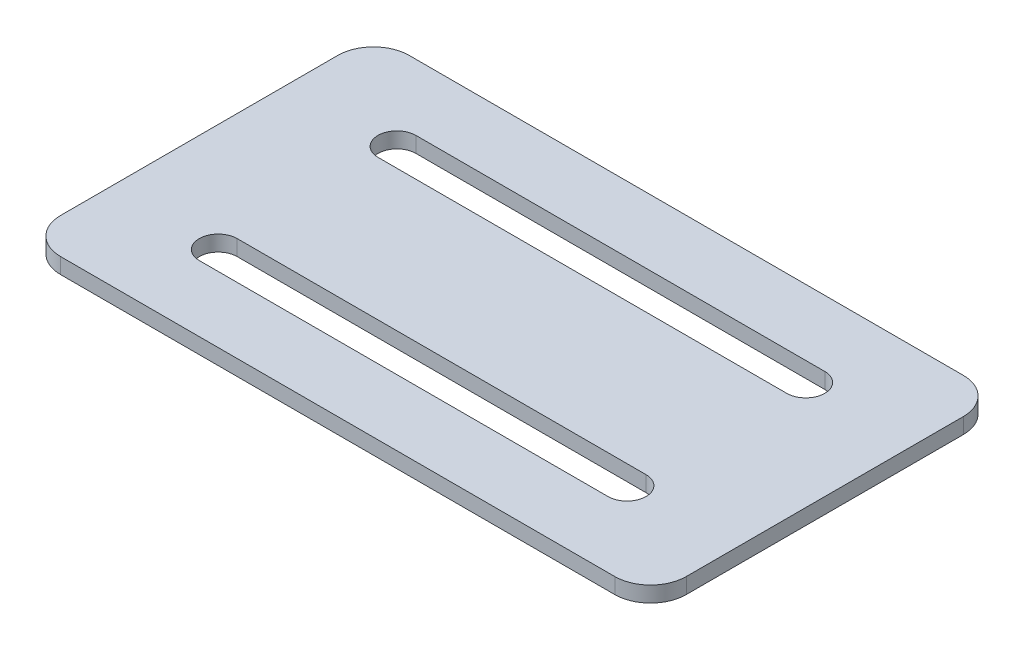
ISO-10303-21;
HEADER;
FILE_DESCRIPTION(('STEP AP214'),'2;1');
FILE_NAME('part.step','',(''),(''),'','','');
FILE_SCHEMA(('AUTOMOTIVE_DESIGN { 1 0 10303 214 1 1 1 1 }'));
ENDSEC;
DATA;
#1=APPLICATION_CONTEXT('core data for automotive mechanical design processes');
#2=APPLICATION_PROTOCOL_DEFINITION('international standard','automotive_design',2000,#1);
#3=PRODUCT_CONTEXT('',#1,'mechanical');
#4=PRODUCT('Part','Part','',(#3));
#5=PRODUCT_RELATED_PRODUCT_CATEGORY('part','',(#4));
#6=PRODUCT_DEFINITION_FORMATION('','',#4);
#7=PRODUCT_DEFINITION_CONTEXT('part definition',#1,'design');
#8=PRODUCT_DEFINITION('design','',#6,#7);
#9=PRODUCT_DEFINITION_SHAPE('','',#8);
#10=(LENGTH_UNIT() NAMED_UNIT(*) SI_UNIT(.MILLI.,.METRE.));
#11=(NAMED_UNIT(*) PLANE_ANGLE_UNIT() SI_UNIT($,.RADIAN.));
#12=(NAMED_UNIT(*) SI_UNIT($,.STERADIAN.) SOLID_ANGLE_UNIT());
#13=UNCERTAINTY_MEASURE_WITH_UNIT(LENGTH_MEASURE(1.E-05),#10,'distance_accuracy_value','');
#14=(GEOMETRIC_REPRESENTATION_CONTEXT(3) GLOBAL_UNCERTAINTY_ASSIGNED_CONTEXT((#13)) GLOBAL_UNIT_ASSIGNED_CONTEXT((#10,
#11,#12)) REPRESENTATION_CONTEXT('',''));
#15=CARTESIAN_POINT('',(0.,0.,0.));
#16=DIRECTION('',(0.,0.,1.));
#17=DIRECTION('',(1.,0.,0.));
#18=AXIS2_PLACEMENT_3D('',#15,#16,#17);
#19=CARTESIAN_POINT('',(328.829800241669,8.00000000000023,329.743581710751));
#20=DIRECTION('',(-1.,0.,0.));
#21=DIRECTION('',(0.,-1.,0.));
#22=AXIS2_PLACEMENT_3D('',#19,#20,#21);
#23=PLANE('',#22);
#24=DIRECTION('',(0.,0.,1.));
#25=VECTOR('',#24,1.);
#26=CARTESIAN_POINT('',(328.829800241669,3.4986687706093,290.624739584268));
#27=LINE('',#26,#25);
#28=CARTESIAN_POINT('',(328.829800241669,3.4986687706093,298.624739584268));
#29=VERTEX_POINT('',#28);
#30=CARTESIAN_POINT('',(328.829800241669,3.49866877060929,360.624739584299));
#31=VERTEX_POINT('',#30);
#32=EDGE_CURVE('E228',#29,#31,#27,.T.);
#33=ORIENTED_EDGE('',*,*,#32,.F.);
#34=DIRECTION('',(0.,1.,0.));
#35=VECTOR('',#34,1.);
#36=CARTESIAN_POINT('',(328.829800241669,8.00000000000023,298.624739584268));
#37=LINE('',#36,#35);
#38=CARTESIAN_POINT('',(328.829800241669,0.,298.624739584268));
#39=VERTEX_POINT('',#38);
#40=EDGE_CURVE('E257',#29,#39,#37,.F.);
#41=ORIENTED_EDGE('',*,*,#40,.T.);
#42=DIRECTION('',(0.,0.,-1.));
#43=VECTOR('',#42,1.);
#44=CARTESIAN_POINT('',(328.829800241669,0.,290.624739584268));
#45=LINE('',#44,#43);
#46=CARTESIAN_POINT('',(328.829800241669,0.,360.624739584299));
#47=VERTEX_POINT('',#46);
#48=EDGE_CURVE('E222',#47,#39,#45,.T.);
#49=ORIENTED_EDGE('',*,*,#48,.F.);
#50=DIRECTION('',(0.,-1.,0.));
#51=VECTOR('',#50,1.);
#52=CARTESIAN_POINT('',(328.829800241669,8.00000000000023,360.624739584299));
#53=LINE('',#52,#51);
#54=EDGE_CURVE('E255',#47,#31,#53,.F.);
#55=ORIENTED_EDGE('',*,*,#54,.T.);
#56=EDGE_LOOP('',(#33,#41,#49,#55));
#57=FACE_BOUND('',#56,.T.);
#58=ADVANCED_FACE('F41',(#57),#23,.T.);
#59=CARTESIAN_POINT('',(468.829800241669,0.,0.));
#60=DIRECTION('',(1.,0.,0.));
#61=DIRECTION('',(0.,0.,-1.));
#62=AXIS2_PLACEMENT_3D('',#59,#60,#61);
#63=PLANE('',#62);
#64=DIRECTION('',(0.,0.,1.));
#65=VECTOR('',#64,1.);
#66=CARTESIAN_POINT('',(468.829800241669,3.49866877060934,290.624739584268));
#67=LINE('',#66,#65);
#68=CARTESIAN_POINT('',(468.829800241669,3.49866877060934,298.624739584268));
#69=VERTEX_POINT('',#68);
#70=CARTESIAN_POINT('',(468.829800241669,3.49866877060933,360.624739584299));
#71=VERTEX_POINT('',#70);
#72=EDGE_CURVE('E219',#69,#71,#67,.T.);
#73=ORIENTED_EDGE('',*,*,#72,.T.);
#74=DIRECTION('',(0.,-1.,0.));
#75=VECTOR('',#74,1.);
#76=CARTESIAN_POINT('',(468.829800241669,0.,360.624739584299));
#77=LINE('',#76,#75);
#78=CARTESIAN_POINT('',(468.829800241669,1.07179607512222E-13,360.624739584299));
#79=VERTEX_POINT('',#78);
#80=EDGE_CURVE('E11',#71,#79,#77,.T.);
#81=ORIENTED_EDGE('',*,*,#80,.T.);
#82=DIRECTION('',(0.,0.,-1.));
#83=VECTOR('',#82,1.);
#84=CARTESIAN_POINT('',(468.829800241669,1.00952395034356E-13,290.624739584268));
#85=LINE('',#84,#83);
#86=CARTESIAN_POINT('',(468.829800241669,1.01664076460398E-13,298.624739584268));
#87=VERTEX_POINT('',#86);
#88=EDGE_CURVE('E218',#79,#87,#85,.T.);
#89=ORIENTED_EDGE('',*,*,#88,.T.);
#90=DIRECTION('',(0.,1.,0.));
#91=VECTOR('',#90,1.);
#92=CARTESIAN_POINT('',(468.829800241669,0.,298.624739584268));
#93=LINE('',#92,#91);
#94=EDGE_CURVE('E49',#87,#69,#93,.T.);
#95=ORIENTED_EDGE('',*,*,#94,.T.);
#96=EDGE_LOOP('',(#73,#81,#89,#95));
#97=FACE_BOUND('',#96,.T.);
#98=ADVANCED_FACE('F275',(#97),#63,.T.);
#99=CARTESIAN_POINT('',(250.75137375156,0.,290.624739584268));
#100=DIRECTION('',(0.,-1.,0.));
#101=DIRECTION('',(1.,0.,0.));
#102=AXIS2_PLACEMENT_3D('',#99,#100,#101);
#103=PLANE('',#102);
#104=CARTESIAN_POINT('',(444.579800241669,1.00613961606655E-13,349.624739584307));
#105=DIRECTION('',(0.,-1.,0.));
#106=DIRECTION('',(1.,0.,0.));
#107=AXIS2_PLACEMENT_3D('',#104,#105,#106);
#108=CIRCLE('',#107,4.25);
#109=CARTESIAN_POINT('',(444.579800241669,0.,345.374739584307));
#110=VERTEX_POINT('',#109);
#111=CARTESIAN_POINT('',(444.579800241669,0.,353.874739584307));
#112=VERTEX_POINT('',#111);
#113=EDGE_CURVE('E216',#110,#112,#108,.T.);
#114=ORIENTED_EDGE('',*,*,#113,.F.);
#115=DIRECTION('',(1.,0.,0.));
#116=VECTOR('',#115,1.);
#117=CARTESIAN_POINT('',(250.75137375156,0.,345.374739584307));
#118=LINE('',#117,#116);
#119=CARTESIAN_POINT('',(353.079800241669,0.,345.374739584307));
#120=VERTEX_POINT('',#119);
#121=EDGE_CURVE('E211',#120,#110,#118,.T.);
#122=ORIENTED_EDGE('',*,*,#121,.F.);
#123=CARTESIAN_POINT('',(353.079800241669,0.,349.624739584307));
#124=DIRECTION('',(0.,-1.,0.));
#125=DIRECTION('',(1.,0.,0.));
#126=AXIS2_PLACEMENT_3D('',#123,#124,#125);
#127=CIRCLE('',#126,4.24999999999998);
#128=CARTESIAN_POINT('',(353.079800241669,0.,353.874739584307));
#129=VERTEX_POINT('',#128);
#130=EDGE_CURVE('E159',#129,#120,#127,.T.);
#131=ORIENTED_EDGE('',*,*,#130,.F.);
#132=DIRECTION('',(-1.,0.,0.));
#133=VECTOR('',#132,1.);
#134=CARTESIAN_POINT('',(250.75137375156,0.,353.874739584307));
#135=LINE('',#134,#133);
#136=EDGE_CURVE('E214',#112,#129,#135,.T.);
#137=ORIENTED_EDGE('',*,*,#136,.F.);
#138=EDGE_LOOP('',(#114,#122,#131,#137));
#139=FACE_BOUND('',#138,.T.);
#140=CARTESIAN_POINT('',(444.579800241669,0.,309.624739584236));
#141=DIRECTION('',(0.,-1.,0.));
#142=DIRECTION('',(1.,0.,0.));
#143=AXIS2_PLACEMENT_3D('',#140,#141,#142);
#144=CIRCLE('',#143,4.24999999999998);
#145=CARTESIAN_POINT('',(444.579800241669,0.,305.374739584237));
#146=VERTEX_POINT('',#145);
#147=CARTESIAN_POINT('',(444.579800241669,0.,313.874739584236));
#148=VERTEX_POINT('',#147);
#149=EDGE_CURVE('E209',#146,#148,#144,.T.);
#150=ORIENTED_EDGE('',*,*,#149,.F.);
#151=DIRECTION('',(1.,0.,0.));
#152=VECTOR('',#151,1.);
#153=CARTESIAN_POINT('',(250.75137375156,0.,305.374739584237));
#154=LINE('',#153,#152);
#155=CARTESIAN_POINT('',(353.079800241669,0.,305.374739584237));
#156=VERTEX_POINT('',#155);
#157=EDGE_CURVE('E183',#156,#146,#154,.T.);
#158=ORIENTED_EDGE('',*,*,#157,.F.);
#159=CARTESIAN_POINT('',(353.079800241669,0.,309.624739584236));
#160=DIRECTION('',(0.,-1.,0.));
#161=DIRECTION('',(1.,0.,0.));
#162=AXIS2_PLACEMENT_3D('',#159,#160,#161);
#163=CIRCLE('',#162,4.25);
#164=CARTESIAN_POINT('',(353.079800241669,0.,313.874739584237));
#165=VERTEX_POINT('',#164);
#166=EDGE_CURVE('E205',#165,#156,#163,.T.);
#167=ORIENTED_EDGE('',*,*,#166,.F.);
#168=DIRECTION('',(-1.,0.,0.));
#169=VECTOR('',#168,1.);
#170=CARTESIAN_POINT('',(250.75137375156,0.,313.874739584237));
#171=LINE('',#170,#169);
#172=EDGE_CURVE('E207',#148,#165,#171,.T.);
#173=ORIENTED_EDGE('',*,*,#172,.F.);
#174=EDGE_LOOP('',(#150,#158,#167,#173));
#175=FACE_BOUND('',#174,.T.);
#176=ORIENTED_EDGE('',*,*,#48,.T.);
#177=CARTESIAN_POINT('',(336.829800241669,0.,298.624739584268));
#178=DIRECTION('',(0.,-1.,0.));
#179=DIRECTION('',(1.,0.,0.));
#180=AXIS2_PLACEMENT_3D('',#177,#178,#179);
#181=CIRCLE('',#180,8.);
#182=CARTESIAN_POINT('',(336.829800241669,0.,290.624739584268));
#183=VERTEX_POINT('',#182);
#184=EDGE_CURVE('E265',#39,#183,#181,.T.);
#185=ORIENTED_EDGE('',*,*,#184,.T.);
#186=DIRECTION('',(1.,0.,0.));
#187=VECTOR('',#186,1.);
#188=CARTESIAN_POINT('',(250.75137375156,0.,290.624739584268));
#189=LINE('',#188,#187);
#190=CARTESIAN_POINT('',(460.829800241669,0.,290.624739584268));
#191=VERTEX_POINT('',#190);
#192=EDGE_CURVE('E227',#183,#191,#189,.T.);
#193=ORIENTED_EDGE('',*,*,#192,.T.);
#194=CARTESIAN_POINT('',(460.829800241669,0.,298.624739584268));
#195=DIRECTION('',(0.,-1.,0.));
#196=DIRECTION('',(1.,0.,0.));
#197=AXIS2_PLACEMENT_3D('',#194,#195,#196);
#198=CIRCLE('',#197,8.);
#199=EDGE_CURVE('E259',#191,#87,#198,.T.);
#200=ORIENTED_EDGE('',*,*,#199,.T.);
#201=ORIENTED_EDGE('',*,*,#88,.F.);
#202=CARTESIAN_POINT('',(460.829800241669,1.05220172633586E-13,360.624739584299));
#203=DIRECTION('',(0.,-1.,0.));
#204=DIRECTION('',(1.,0.,0.));
#205=AXIS2_PLACEMENT_3D('',#202,#203,#204);
#206=CIRCLE('',#205,8.);
#207=CARTESIAN_POINT('',(460.829800241669,1.05931854059628E-13,368.624739584299));
#208=VERTEX_POINT('',#207);
#209=EDGE_CURVE('E261',#79,#208,#206,.T.);
#210=ORIENTED_EDGE('',*,*,#209,.T.);
#211=DIRECTION('',(1.,0.,0.));
#212=VECTOR('',#211,1.);
#213=CARTESIAN_POINT('',(250.75137375156,0.,368.624739584299));
#214=LINE('',#213,#212);
#215=CARTESIAN_POINT('',(336.829800241669,0.,368.624739584299));
#216=VERTEX_POINT('',#215);
#217=EDGE_CURVE('E235',#216,#208,#214,.T.);
#218=ORIENTED_EDGE('',*,*,#217,.F.);
#219=CARTESIAN_POINT('',(336.829800241669,0.,360.624739584299));
#220=DIRECTION('',(0.,-1.,0.));
#221=DIRECTION('',(1.,0.,0.));
#222=AXIS2_PLACEMENT_3D('',#219,#220,#221);
#223=CIRCLE('',#222,8.);
#224=EDGE_CURVE('E263',#216,#47,#223,.T.);
#225=ORIENTED_EDGE('',*,*,#224,.T.);
#226=EDGE_LOOP('',(#176,#185,#193,#200,#201,#210,#218,#225));
#227=FACE_BOUND('',#226,.T.);
#228=ADVANCED_FACE('F288',(#139,#175,#227),#103,.T.);
#229=CARTESIAN_POINT('',(250.75137375156,0.,290.624739584268));
#230=DIRECTION('',(0.,0.,-1.));
#231=DIRECTION('',(-1.,0.,0.));
#232=AXIS2_PLACEMENT_3D('',#229,#230,#231);
#233=PLANE('',#232);
#234=ORIENTED_EDGE('',*,*,#192,.F.);
#235=DIRECTION('',(0.,1.,0.));
#236=VECTOR('',#235,1.);
#237=CARTESIAN_POINT('',(336.829800241669,0.,290.624739584268));
#238=LINE('',#237,#236);
#239=CARTESIAN_POINT('',(336.829800241669,3.4986687706093,290.624739584268));
#240=VERTEX_POINT('',#239);
#241=EDGE_CURVE('E244',#183,#240,#238,.T.);
#242=ORIENTED_EDGE('',*,*,#241,.T.);
#243=DIRECTION('',(1.,0.,0.));
#244=VECTOR('',#243,1.);
#245=CARTESIAN_POINT('',(250.75137375156,3.49866877060928,290.624739584268));
#246=LINE('',#245,#244);
#247=CARTESIAN_POINT('',(460.829800241669,3.49866877060933,290.624739584268));
#248=VERTEX_POINT('',#247);
#249=EDGE_CURVE('E232',#240,#248,#246,.T.);
#250=ORIENTED_EDGE('',*,*,#249,.T.);
#251=DIRECTION('',(0.,1.,0.));
#252=VECTOR('',#251,1.);
#253=CARTESIAN_POINT('',(460.829800241669,0.,290.624739584268));
#254=LINE('',#253,#252);
#255=EDGE_CURVE('E242',#248,#191,#254,.F.);
#256=ORIENTED_EDGE('',*,*,#255,.T.);
#257=EDGE_LOOP('',(#234,#242,#250,#256));
#258=FACE_BOUND('',#257,.T.);
#259=ADVANCED_FACE('F293',(#258),#233,.T.);
#260=CARTESIAN_POINT('',(250.75137375156,3.49866877060928,290.624739584268));
#261=DIRECTION('',(0.,1.,0.));
#262=DIRECTION('',(-1.,0.,0.));
#263=AXIS2_PLACEMENT_3D('',#260,#261,#262);
#264=PLANE('',#263);
#265=CARTESIAN_POINT('',(444.579800241669,3.49866877060932,349.624739584307));
#266=DIRECTION('',(0.,1.,0.));
#267=DIRECTION('',(-1.,0.,0.));
#268=AXIS2_PLACEMENT_3D('',#265,#266,#267);
#269=CIRCLE('',#268,4.25);
#270=CARTESIAN_POINT('',(444.579800241669,3.49866877060932,353.874739584307));
#271=VERTEX_POINT('',#270);
#272=CARTESIAN_POINT('',(444.579800241669,3.49866877060932,345.374739584307));
#273=VERTEX_POINT('',#272);
#274=EDGE_CURVE('E171',#271,#273,#269,.T.);
#275=ORIENTED_EDGE('',*,*,#274,.F.);
#276=DIRECTION('',(1.,0.,0.));
#277=VECTOR('',#276,1.);
#278=CARTESIAN_POINT('',(353.079800241669,3.4986687706093,353.874739584307));
#279=LINE('',#278,#277);
#280=CARTESIAN_POINT('',(353.079800241669,3.4986687706093,353.874739584307));
#281=VERTEX_POINT('',#280);
#282=EDGE_CURVE('E176',#281,#271,#279,.T.);
#283=ORIENTED_EDGE('',*,*,#282,.F.);
#284=CARTESIAN_POINT('',(353.079800241669,3.4986687706093,349.624739584307));
#285=DIRECTION('',(0.,1.,0.));
#286=DIRECTION('',(-1.,0.,0.));
#287=AXIS2_PLACEMENT_3D('',#284,#285,#286);
#288=CIRCLE('',#287,4.24999999999998);
#289=CARTESIAN_POINT('',(353.079800241669,3.4986687706093,345.374739584307));
#290=VERTEX_POINT('',#289);
#291=EDGE_CURVE('E156',#290,#281,#288,.T.);
#292=ORIENTED_EDGE('',*,*,#291,.F.);
#293=DIRECTION('',(-1.,0.,0.));
#294=VECTOR('',#293,1.);
#295=CARTESIAN_POINT('',(353.079800241669,3.4986687706093,345.374739584307));
#296=LINE('',#295,#294);
#297=EDGE_CURVE('E166',#273,#290,#296,.T.);
#298=ORIENTED_EDGE('',*,*,#297,.F.);
#299=EDGE_LOOP('',(#275,#283,#292,#298));
#300=FACE_BOUND('',#299,.T.);
#301=CARTESIAN_POINT('',(444.579800241669,3.49866877060933,309.624739584236));
#302=DIRECTION('',(0.,1.,0.));
#303=DIRECTION('',(-1.,0.,0.));
#304=AXIS2_PLACEMENT_3D('',#301,#302,#303);
#305=CIRCLE('',#304,4.24999999999998);
#306=CARTESIAN_POINT('',(444.579800241669,3.49866877060933,313.874739584236));
#307=VERTEX_POINT('',#306);
#308=CARTESIAN_POINT('',(444.579800241669,3.49866877060933,305.374739584237));
#309=VERTEX_POINT('',#308);
#310=EDGE_CURVE('E202',#307,#309,#305,.T.);
#311=ORIENTED_EDGE('',*,*,#310,.F.);
#312=DIRECTION('',(1.,0.,0.));
#313=VECTOR('',#312,1.);
#314=CARTESIAN_POINT('',(353.079800241669,3.49866877060931,313.874739584237));
#315=LINE('',#314,#313);
#316=CARTESIAN_POINT('',(353.079800241669,3.49866877060931,313.874739584237));
#317=VERTEX_POINT('',#316);
#318=EDGE_CURVE('E189',#317,#307,#315,.T.);
#319=ORIENTED_EDGE('',*,*,#318,.F.);
#320=CARTESIAN_POINT('',(353.079800241669,3.49866877060931,309.624739584236));
#321=DIRECTION('',(0.,1.,0.));
#322=DIRECTION('',(-1.,0.,0.));
#323=AXIS2_PLACEMENT_3D('',#320,#321,#322);
#324=CIRCLE('',#323,4.25);
#325=CARTESIAN_POINT('',(353.079800241669,3.49866877060931,305.374739584236));
#326=VERTEX_POINT('',#325);
#327=EDGE_CURVE('E197',#326,#317,#324,.T.);
#328=ORIENTED_EDGE('',*,*,#327,.F.);
#329=DIRECTION('',(-1.,0.,0.));
#330=VECTOR('',#329,1.);
#331=CARTESIAN_POINT('',(353.079800241669,3.49866877060931,305.374739584237));
#332=LINE('',#331,#330);
#333=EDGE_CURVE('E200',#309,#326,#332,.T.);
#334=ORIENTED_EDGE('',*,*,#333,.F.);
#335=EDGE_LOOP('',(#311,#319,#328,#334));
#336=FACE_BOUND('',#335,.T.);
#337=ORIENTED_EDGE('',*,*,#249,.F.);
#338=CARTESIAN_POINT('',(336.829800241669,3.4986687706093,298.624739584268));
#339=DIRECTION('',(0.,1.,0.));
#340=DIRECTION('',(-1.,0.,0.));
#341=AXIS2_PLACEMENT_3D('',#338,#339,#340);
#342=CIRCLE('',#341,8.);
#343=EDGE_CURVE('E253',#240,#29,#342,.T.);
#344=ORIENTED_EDGE('',*,*,#343,.T.);
#345=ORIENTED_EDGE('',*,*,#32,.T.);
#346=CARTESIAN_POINT('',(336.829800241669,3.4986687706093,360.624739584299));
#347=DIRECTION('',(0.,1.,0.));
#348=DIRECTION('',(-1.,0.,0.));
#349=AXIS2_PLACEMENT_3D('',#346,#347,#348);
#350=CIRCLE('',#349,8.);
#351=CARTESIAN_POINT('',(336.829800241669,3.49866877060929,368.624739584299));
#352=VERTEX_POINT('',#351);
#353=EDGE_CURVE('E251',#31,#352,#350,.T.);
#354=ORIENTED_EDGE('',*,*,#353,.T.);
#355=DIRECTION('',(1.,0.,0.));
#356=VECTOR('',#355,1.);
#357=CARTESIAN_POINT('',(250.75137375156,3.49866877060927,368.624739584299));
#358=LINE('',#357,#356);
#359=CARTESIAN_POINT('',(460.829800241669,3.49866877060933,368.624739584299));
#360=VERTEX_POINT('',#359);
#361=EDGE_CURVE('E231',#352,#360,#358,.T.);
#362=ORIENTED_EDGE('',*,*,#361,.T.);
#363=CARTESIAN_POINT('',(460.829800241669,3.49866877060933,360.624739584299));
#364=DIRECTION('',(0.,1.,0.));
#365=DIRECTION('',(-1.,0.,0.));
#366=AXIS2_PLACEMENT_3D('',#363,#364,#365);
#367=CIRCLE('',#366,8.);
#368=EDGE_CURVE('E249',#360,#71,#367,.T.);
#369=ORIENTED_EDGE('',*,*,#368,.T.);
#370=ORIENTED_EDGE('',*,*,#72,.F.);
#371=CARTESIAN_POINT('',(460.829800241669,3.49866877060933,298.624739584268));
#372=DIRECTION('',(0.,1.,0.));
#373=DIRECTION('',(-1.,0.,0.));
#374=AXIS2_PLACEMENT_3D('',#371,#372,#373);
#375=CIRCLE('',#374,8.);
#376=EDGE_CURVE('E247',#69,#248,#375,.T.);
#377=ORIENTED_EDGE('',*,*,#376,.T.);
#378=EDGE_LOOP('',(#337,#344,#345,#354,#362,#369,#370,#377));
#379=FACE_BOUND('',#378,.T.);
#380=ADVANCED_FACE('F173',(#300,#336,#379),#264,.T.);
#381=CARTESIAN_POINT('',(250.75137375156,0.,368.624739584299));
#382=DIRECTION('',(0.,0.,1.));
#383=DIRECTION('',(1.,0.,0.));
#384=AXIS2_PLACEMENT_3D('',#381,#382,#383);
#385=PLANE('',#384);
#386=ORIENTED_EDGE('',*,*,#361,.F.);
#387=DIRECTION('',(0.,-1.,0.));
#388=VECTOR('',#387,1.);
#389=CARTESIAN_POINT('',(336.829800241669,0.,368.624739584299));
#390=LINE('',#389,#388);
#391=EDGE_CURVE('E269',#352,#216,#390,.T.);
#392=ORIENTED_EDGE('',*,*,#391,.T.);
#393=ORIENTED_EDGE('',*,*,#217,.T.);
#394=DIRECTION('',(0.,-1.,0.));
#395=VECTOR('',#394,1.);
#396=CARTESIAN_POINT('',(460.829800241669,0.,368.624739584299));
#397=LINE('',#396,#395);
#398=EDGE_CURVE('E267',#208,#360,#397,.F.);
#399=ORIENTED_EDGE('',*,*,#398,.T.);
#400=EDGE_LOOP('',(#386,#392,#393,#399));
#401=FACE_BOUND('',#400,.T.);
#402=ADVANCED_FACE('F308',(#401),#385,.T.);
#403=CARTESIAN_POINT('',(336.829800241669,0.,298.624739584268));
#404=DIRECTION('',(0.,1.,0.));
#405=DIRECTION('',(-1.,0.,0.));
#406=AXIS2_PLACEMENT_3D('',#403,#404,#405);
#407=CYLINDRICAL_SURFACE('',#406,8.);
#408=ORIENTED_EDGE('',*,*,#184,.F.);
#409=ORIENTED_EDGE('',*,*,#40,.F.);
#410=ORIENTED_EDGE('',*,*,#343,.F.);
#411=ORIENTED_EDGE('',*,*,#241,.F.);
#412=EDGE_LOOP('',(#408,#409,#410,#411));
#413=FACE_BOUND('',#412,.T.);
#414=ADVANCED_FACE('F303',(#413),#407,.T.);
#415=CARTESIAN_POINT('',(336.829800241669,0.,360.624739584299));
#416=DIRECTION('',(0.,-1.,0.));
#417=DIRECTION('',(1.,0.,0.));
#418=AXIS2_PLACEMENT_3D('',#415,#416,#417);
#419=CYLINDRICAL_SURFACE('',#418,8.);
#420=ORIENTED_EDGE('',*,*,#353,.F.);
#421=ORIENTED_EDGE('',*,*,#54,.F.);
#422=ORIENTED_EDGE('',*,*,#224,.F.);
#423=ORIENTED_EDGE('',*,*,#391,.F.);
#424=EDGE_LOOP('',(#420,#421,#422,#423));
#425=FACE_BOUND('',#424,.T.);
#426=ADVANCED_FACE('F305',(#425),#419,.T.);
#427=CARTESIAN_POINT('',(460.829800241669,0.,360.624739584299));
#428=DIRECTION('',(0.,-1.,0.));
#429=DIRECTION('',(0.,0.,-1.));
#430=AXIS2_PLACEMENT_3D('',#427,#428,#429);
#431=CYLINDRICAL_SURFACE('',#430,8.);
#432=ORIENTED_EDGE('',*,*,#368,.F.);
#433=ORIENTED_EDGE('',*,*,#398,.F.);
#434=ORIENTED_EDGE('',*,*,#209,.F.);
#435=ORIENTED_EDGE('',*,*,#80,.F.);
#436=EDGE_LOOP('',(#432,#433,#434,#435));
#437=FACE_BOUND('',#436,.T.);
#438=ADVANCED_FACE('F286',(#437),#431,.T.);
#439=CARTESIAN_POINT('',(460.829800241669,0.,298.624739584268));
#440=DIRECTION('',(0.,1.,0.));
#441=DIRECTION('',(0.,0.,1.));
#442=AXIS2_PLACEMENT_3D('',#439,#440,#441);
#443=CYLINDRICAL_SURFACE('',#442,8.);
#444=ORIENTED_EDGE('',*,*,#199,.F.);
#445=ORIENTED_EDGE('',*,*,#255,.F.);
#446=ORIENTED_EDGE('',*,*,#376,.F.);
#447=ORIENTED_EDGE('',*,*,#94,.F.);
#448=EDGE_LOOP('',(#444,#445,#446,#447));
#449=FACE_BOUND('',#448,.T.);
#450=ADVANCED_FACE('F43',(#449),#443,.T.);
#451=CARTESIAN_POINT('',(444.579800241669,-6.50133122939067,309.624739584236));
#452=DIRECTION('',(0.,1.,0.));
#453=DIRECTION('',(-1.,0.,0.));
#454=AXIS2_PLACEMENT_3D('',#451,#452,#453);
#455=CYLINDRICAL_SURFACE('',#454,4.24999999999998);
#456=ORIENTED_EDGE('',*,*,#149,.T.);
#457=DIRECTION('',(0.,1.,0.));
#458=VECTOR('',#457,1.);
#459=CARTESIAN_POINT('',(444.579800241669,-6.50133122939067,313.874739584236));
#460=LINE('',#459,#458);
#461=EDGE_CURVE('E193',#148,#307,#460,.T.);
#462=ORIENTED_EDGE('',*,*,#461,.T.);
#463=ORIENTED_EDGE('',*,*,#310,.T.);
#464=DIRECTION('',(0.,1.,0.));
#465=VECTOR('',#464,1.);
#466=CARTESIAN_POINT('',(444.579800241669,-6.50133122939067,305.374739584237));
#467=LINE('',#466,#465);
#468=EDGE_CURVE('E186',#146,#309,#467,.T.);
#469=ORIENTED_EDGE('',*,*,#468,.F.);
#470=EDGE_LOOP('',(#456,#462,#463,#469));
#471=FACE_BOUND('',#470,.T.);
#472=ADVANCED_FACE('F332',(#471),#455,.F.);
#473=CARTESIAN_POINT('',(353.079800241669,-6.50133122939069,313.874739584237));
#474=DIRECTION('',(0.,0.,1.));
#475=DIRECTION('',(1.,0.,0.));
#476=AXIS2_PLACEMENT_3D('',#473,#474,#475);
#477=PLANE('',#476);
#478=ORIENTED_EDGE('',*,*,#172,.T.);
#479=DIRECTION('',(0.,1.,0.));
#480=VECTOR('',#479,1.);
#481=CARTESIAN_POINT('',(353.079800241669,-6.50133122939069,313.874739584237));
#482=LINE('',#481,#480);
#483=EDGE_CURVE('E191',#165,#317,#482,.T.);
#484=ORIENTED_EDGE('',*,*,#483,.T.);
#485=ORIENTED_EDGE('',*,*,#318,.T.);
#486=ORIENTED_EDGE('',*,*,#461,.F.);
#487=EDGE_LOOP('',(#478,#484,#485,#486));
#488=FACE_BOUND('',#487,.T.);
#489=ADVANCED_FACE('F337',(#488),#477,.F.);
#490=CARTESIAN_POINT('',(353.079800241669,-6.50133122939069,309.624739584236));
#491=DIRECTION('',(0.,1.,0.));
#492=DIRECTION('',(-1.,0.,0.));
#493=AXIS2_PLACEMENT_3D('',#490,#491,#492);
#494=CYLINDRICAL_SURFACE('',#493,4.25);
#495=ORIENTED_EDGE('',*,*,#166,.T.);
#496=DIRECTION('',(0.,1.,0.));
#497=VECTOR('',#496,1.);
#498=CARTESIAN_POINT('',(353.079800241669,-6.50133122939069,305.374739584236));
#499=LINE('',#498,#497);
#500=EDGE_CURVE('E64',#156,#326,#499,.T.);
#501=ORIENTED_EDGE('',*,*,#500,.T.);
#502=ORIENTED_EDGE('',*,*,#327,.T.);
#503=ORIENTED_EDGE('',*,*,#483,.F.);
#504=EDGE_LOOP('',(#495,#501,#502,#503));
#505=FACE_BOUND('',#504,.T.);
#506=ADVANCED_FACE('F343',(#505),#494,.F.);
#507=CARTESIAN_POINT('',(353.079800241669,-6.50133122939069,305.374739584237));
#508=DIRECTION('',(0.,0.,-1.));
#509=DIRECTION('',(0.,1.,0.));
#510=AXIS2_PLACEMENT_3D('',#507,#508,#509);
#511=PLANE('',#510);
#512=ORIENTED_EDGE('',*,*,#157,.T.);
#513=ORIENTED_EDGE('',*,*,#468,.T.);
#514=ORIENTED_EDGE('',*,*,#333,.T.);
#515=ORIENTED_EDGE('',*,*,#500,.F.);
#516=EDGE_LOOP('',(#512,#513,#514,#515));
#517=FACE_BOUND('',#516,.T.);
#518=ADVANCED_FACE('F350',(#517),#511,.F.);
#519=CARTESIAN_POINT('',(444.579800241669,-6.50133122939068,349.624739584307));
#520=DIRECTION('',(0.,1.,0.));
#521=DIRECTION('',(-1.,0.,0.));
#522=AXIS2_PLACEMENT_3D('',#519,#520,#521);
#523=CYLINDRICAL_SURFACE('',#522,4.25);
#524=ORIENTED_EDGE('',*,*,#113,.T.);
#525=DIRECTION('',(0.,1.,0.));
#526=VECTOR('',#525,1.);
#527=CARTESIAN_POINT('',(444.579800241669,-6.50133122939068,353.874739584307));
#528=LINE('',#527,#526);
#529=EDGE_CURVE('E181',#112,#271,#528,.T.);
#530=ORIENTED_EDGE('',*,*,#529,.T.);
#531=ORIENTED_EDGE('',*,*,#274,.T.);
#532=DIRECTION('',(0.,1.,0.));
#533=VECTOR('',#532,1.);
#534=CARTESIAN_POINT('',(444.579800241669,-6.50133122939068,345.374739584307));
#535=LINE('',#534,#533);
#536=EDGE_CURVE('E162',#110,#273,#535,.T.);
#537=ORIENTED_EDGE('',*,*,#536,.F.);
#538=EDGE_LOOP('',(#524,#530,#531,#537));
#539=FACE_BOUND('',#538,.T.);
#540=ADVANCED_FACE('F348',(#539),#523,.F.);
#541=CARTESIAN_POINT('',(353.079800241669,-6.5013312293907,353.874739584307));
#542=DIRECTION('',(0.,0.,1.));
#543=DIRECTION('',(0.,-1.,0.));
#544=AXIS2_PLACEMENT_3D('',#541,#542,#543);
#545=PLANE('',#544);
#546=ORIENTED_EDGE('',*,*,#136,.T.);
#547=DIRECTION('',(0.,1.,0.));
#548=VECTOR('',#547,1.);
#549=CARTESIAN_POINT('',(353.079800241669,-6.5013312293907,353.874739584307));
#550=LINE('',#549,#548);
#551=EDGE_CURVE('E161',#129,#281,#550,.T.);
#552=ORIENTED_EDGE('',*,*,#551,.T.);
#553=ORIENTED_EDGE('',*,*,#282,.T.);
#554=ORIENTED_EDGE('',*,*,#529,.F.);
#555=EDGE_LOOP('',(#546,#552,#553,#554));
#556=FACE_BOUND('',#555,.T.);
#557=ADVANCED_FACE('F377',(#556),#545,.F.);
#558=CARTESIAN_POINT('',(353.079800241669,-6.5013312293907,349.624739584307));
#559=DIRECTION('',(0.,1.,0.));
#560=DIRECTION('',(-1.,0.,0.));
#561=AXIS2_PLACEMENT_3D('',#558,#559,#560);
#562=CYLINDRICAL_SURFACE('',#561,4.24999999999998);
#563=ORIENTED_EDGE('',*,*,#130,.T.);
#564=DIRECTION('',(0.,1.,0.));
#565=VECTOR('',#564,1.);
#566=CARTESIAN_POINT('',(353.079800241669,-6.5013312293907,345.374739584307));
#567=LINE('',#566,#565);
#568=EDGE_CURVE('E56',#120,#290,#567,.T.);
#569=ORIENTED_EDGE('',*,*,#568,.T.);
#570=ORIENTED_EDGE('',*,*,#291,.T.);
#571=ORIENTED_EDGE('',*,*,#551,.F.);
#572=EDGE_LOOP('',(#563,#569,#570,#571));
#573=FACE_BOUND('',#572,.T.);
#574=ADVANCED_FACE('F153',(#573),#562,.F.);
#575=CARTESIAN_POINT('',(353.079800241669,-6.5013312293907,345.374739584307));
#576=DIRECTION('',(0.,0.,-1.));
#577=DIRECTION('',(-1.,0.,0.));
#578=AXIS2_PLACEMENT_3D('',#575,#576,#577);
#579=PLANE('',#578);
#580=ORIENTED_EDGE('',*,*,#121,.T.);
#581=ORIENTED_EDGE('',*,*,#536,.T.);
#582=ORIENTED_EDGE('',*,*,#297,.T.);
#583=ORIENTED_EDGE('',*,*,#568,.F.);
#584=EDGE_LOOP('',(#580,#581,#582,#583));
#585=FACE_BOUND('',#584,.T.);
#586=ADVANCED_FACE('F167',(#585),#579,.F.);
#587=CLOSED_SHELL('',(#58,#98,#228,#259,#380,#402,#414,#426,#438,#450,#472,#489,#506,#518,#540,
#557,#574,#586));
#588=MANIFOLD_SOLID_BREP('B2',#587);
#589=ADVANCED_BREP_SHAPE_REPRESENTATION('',(#18,#588),#14);
#590=SHAPE_DEFINITION_REPRESENTATION(#9,#589);
ENDSEC;
END-ISO-10303-21;
